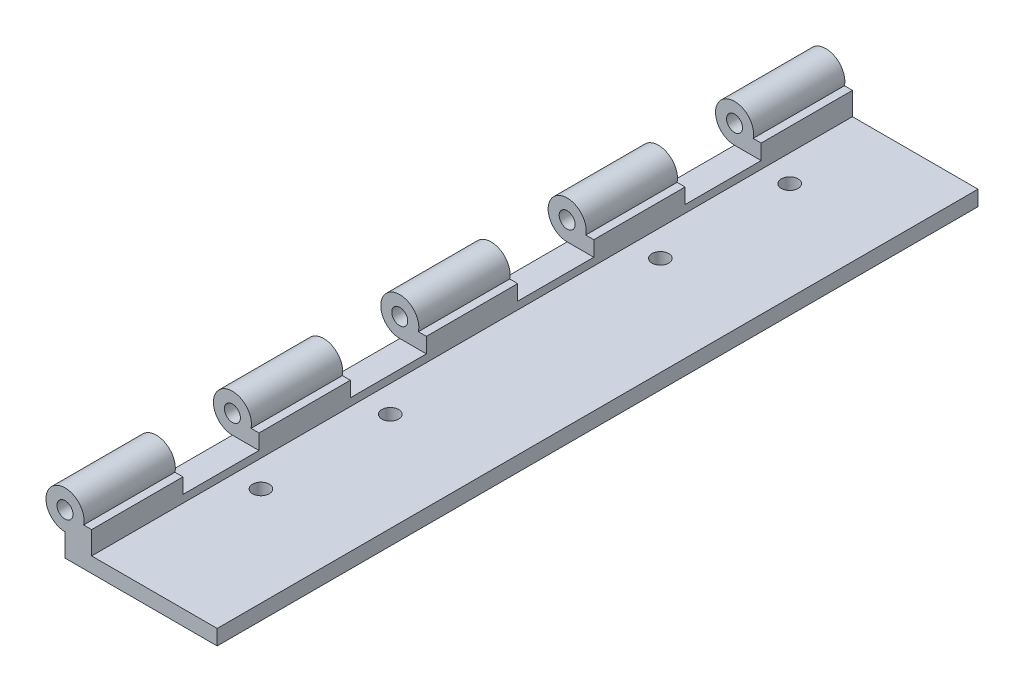
ISO-10303-21;
HEADER;
FILE_DESCRIPTION(('STEP AP214'),'2;1');
FILE_NAME('part.step','',(''),(''),'','','');
FILE_SCHEMA(('AUTOMOTIVE_DESIGN { 1 0 10303 214 1 1 1 1 }'));
ENDSEC;
DATA;
#1=APPLICATION_CONTEXT('core data for automotive mechanical design processes');
#2=APPLICATION_PROTOCOL_DEFINITION('international standard','automotive_design',2000,#1);
#3=PRODUCT_CONTEXT('',#1,'mechanical');
#4=PRODUCT('Part','Part','',(#3));
#5=PRODUCT_RELATED_PRODUCT_CATEGORY('part','',(#4));
#6=PRODUCT_DEFINITION_FORMATION('','',#4);
#7=PRODUCT_DEFINITION_CONTEXT('part definition',#1,'design');
#8=PRODUCT_DEFINITION('design','',#6,#7);
#9=PRODUCT_DEFINITION_SHAPE('','',#8);
#10=(LENGTH_UNIT() NAMED_UNIT(*) SI_UNIT(.MILLI.,.METRE.));
#11=(NAMED_UNIT(*) PLANE_ANGLE_UNIT() SI_UNIT($,.RADIAN.));
#12=(NAMED_UNIT(*) SI_UNIT($,.STERADIAN.) SOLID_ANGLE_UNIT());
#13=UNCERTAINTY_MEASURE_WITH_UNIT(LENGTH_MEASURE(1.E-05),#10,'distance_accuracy_value','');
#14=(GEOMETRIC_REPRESENTATION_CONTEXT(3) GLOBAL_UNCERTAINTY_ASSIGNED_CONTEXT((#13)) GLOBAL_UNIT_ASSIGNED_CONTEXT((#10,
#11,#12)) REPRESENTATION_CONTEXT('',''));
#15=CARTESIAN_POINT('',(0.,0.,0.));
#16=DIRECTION('',(0.,0.,1.));
#17=DIRECTION('',(1.,0.,0.));
#18=AXIS2_PLACEMENT_3D('',#15,#16,#17);
#19=CARTESIAN_POINT('',(0.,0.,0.));
#20=DIRECTION('',(0.,-1.,0.));
#21=DIRECTION('',(0.,0.,-1.));
#22=AXIS2_PLACEMENT_3D('',#19,#20,#21);
#23=PLANE('',#22);
#24=DIRECTION('',(-1.,0.,0.));
#25=VECTOR('',#24,1.);
#26=CARTESIAN_POINT('',(0.,0.,-13.));
#27=LINE('',#26,#25);
#28=CARTESIAN_POINT('',(0.,0.,-13.));
#29=VERTEX_POINT('',#28);
#30=CARTESIAN_POINT('',(-3.49999999999993,0.,-13.));
#31=VERTEX_POINT('',#30);
#32=EDGE_CURVE('E421',#29,#31,#27,.T.);
#33=ORIENTED_EDGE('',*,*,#32,.F.);
#34=DIRECTION('',(0.,0.,1.));
#35=VECTOR('',#34,1.);
#36=CARTESIAN_POINT('',(0.,0.,-101.));
#37=LINE('',#36,#35);
#38=CARTESIAN_POINT('',(0.,0.,-23.));
#39=VERTEX_POINT('',#38);
#40=EDGE_CURVE('E236',#39,#29,#37,.T.);
#41=ORIENTED_EDGE('',*,*,#40,.F.);
#42=DIRECTION('',(-1.,0.,0.));
#43=VECTOR('',#42,1.);
#44=CARTESIAN_POINT('',(0.,0.,-23.));
#45=LINE('',#44,#43);
#46=CARTESIAN_POINT('',(-3.49999999999995,0.,-23.));
#47=VERTEX_POINT('',#46);
#48=EDGE_CURVE('E371',#39,#47,#45,.T.);
#49=ORIENTED_EDGE('',*,*,#48,.T.);
#50=DIRECTION('',(0.,0.,-1.));
#51=VECTOR('',#50,1.);
#52=CARTESIAN_POINT('',(-3.49999999999993,0.,-1.00000000000001));
#53=LINE('',#52,#51);
#54=EDGE_CURVE('E215',#31,#47,#53,.T.);
#55=ORIENTED_EDGE('',*,*,#54,.F.);
#56=EDGE_LOOP('',(#33,#41,#49,#55));
#57=FACE_BOUND('',#56,.T.);
#58=ADVANCED_FACE('F41',(#57),#23,.F.);
#59=DIRECTION('',(-1.,0.,0.));
#60=VECTOR('',#59,1.);
#61=CARTESIAN_POINT('',(0.,0.,-35.));
#62=LINE('',#61,#60);
#63=CARTESIAN_POINT('',(0.,0.,-35.));
#64=VERTEX_POINT('',#63);
#65=CARTESIAN_POINT('',(-3.49999999999996,0.,-35.));
#66=VERTEX_POINT('',#65);
#67=EDGE_CURVE('E377',#64,#66,#62,.T.);
#68=ORIENTED_EDGE('',*,*,#67,.F.);
#69=CARTESIAN_POINT('',(0.,0.,-45.));
#70=VERTEX_POINT('',#69);
#71=EDGE_CURVE('E255',#70,#64,#37,.T.);
#72=ORIENTED_EDGE('',*,*,#71,.F.);
#73=DIRECTION('',(-1.,0.,0.));
#74=VECTOR('',#73,1.);
#75=CARTESIAN_POINT('',(0.,0.,-45.));
#76=LINE('',#75,#74);
#77=CARTESIAN_POINT('',(-3.49999999999996,0.,-45.));
#78=VERTEX_POINT('',#77);
#79=EDGE_CURVE('E340',#70,#78,#76,.T.);
#80=ORIENTED_EDGE('',*,*,#79,.T.);
#81=EDGE_CURVE('E407',#66,#78,#53,.T.);
#82=ORIENTED_EDGE('',*,*,#81,.F.);
#83=EDGE_LOOP('',(#68,#72,#80,#82));
#84=FACE_BOUND('',#83,.T.);
#85=ADVANCED_FACE('F475',(#84),#23,.F.);
#86=DIRECTION('',(-1.,0.,0.));
#87=VECTOR('',#86,1.);
#88=CARTESIAN_POINT('',(0.,0.,-57.));
#89=LINE('',#88,#87);
#90=CARTESIAN_POINT('',(0.,0.,-57.));
#91=VERTEX_POINT('',#90);
#92=CARTESIAN_POINT('',(-3.49999999999997,0.,-57.));
#93=VERTEX_POINT('',#92);
#94=EDGE_CURVE('E336',#91,#93,#89,.T.);
#95=ORIENTED_EDGE('',*,*,#94,.F.);
#96=CARTESIAN_POINT('',(0.,0.,-67.));
#97=VERTEX_POINT('',#96);
#98=EDGE_CURVE('E515',#97,#91,#37,.T.);
#99=ORIENTED_EDGE('',*,*,#98,.F.);
#100=DIRECTION('',(-1.,0.,0.));
#101=VECTOR('',#100,1.);
#102=CARTESIAN_POINT('',(0.,0.,-67.));
#103=LINE('',#102,#101);
#104=CARTESIAN_POINT('',(-3.49999999999998,0.,-67.));
#105=VERTEX_POINT('',#104);
#106=EDGE_CURVE('E282',#97,#105,#103,.T.);
#107=ORIENTED_EDGE('',*,*,#106,.T.);
#108=EDGE_CURVE('E499',#93,#105,#53,.T.);
#109=ORIENTED_EDGE('',*,*,#108,.F.);
#110=EDGE_LOOP('',(#95,#99,#107,#109));
#111=FACE_BOUND('',#110,.T.);
#112=ADVANCED_FACE('F465',(#111),#23,.F.);
#113=CARTESIAN_POINT('',(16.5000000000001,-2.,-1.00000000000001));
#114=DIRECTION('',(-1.,0.,0.));
#115=DIRECTION('',(0.,0.,1.));
#116=AXIS2_PLACEMENT_3D('',#113,#114,#115);
#117=PLANE('',#116);
#118=DIRECTION('',(0.,0.,-1.));
#119=VECTOR('',#118,1.);
#120=CARTESIAN_POINT('',(16.5000000000001,-1.,-101.));
#121=LINE('',#120,#119);
#122=CARTESIAN_POINT('',(16.5000000000001,-1.,-1.00000000000001));
#123=VERTEX_POINT('',#122);
#124=CARTESIAN_POINT('',(16.5000000000001,-1.,-101.));
#125=VERTEX_POINT('',#124);
#126=EDGE_CURVE('E247',#123,#125,#121,.T.);
#127=ORIENTED_EDGE('',*,*,#126,.F.);
#128=DIRECTION('',(0.,1.,0.));
#129=VECTOR('',#128,1.);
#130=CARTESIAN_POINT('',(16.5000000000001,-2.,-1.00000000000001));
#131=LINE('',#130,#129);
#132=CARTESIAN_POINT('',(16.5000000000001,-3.,-1.00000000000001));
#133=VERTEX_POINT('',#132);
#134=EDGE_CURVE('E212',#133,#123,#131,.T.);
#135=ORIENTED_EDGE('',*,*,#134,.F.);
#136=DIRECTION('',(0.,0.,1.));
#137=VECTOR('',#136,1.);
#138=CARTESIAN_POINT('',(16.5000000000001,-3.,-101.));
#139=LINE('',#138,#137);
#140=CARTESIAN_POINT('',(16.5000000000001,-3.,-101.));
#141=VERTEX_POINT('',#140);
#142=EDGE_CURVE('E226',#141,#133,#139,.T.);
#143=ORIENTED_EDGE('',*,*,#142,.F.);
#144=DIRECTION('',(0.,1.,0.));
#145=VECTOR('',#144,1.);
#146=CARTESIAN_POINT('',(16.5000000000001,-2.,-101.));
#147=LINE('',#146,#145);
#148=EDGE_CURVE('E409',#141,#125,#147,.T.);
#149=ORIENTED_EDGE('',*,*,#148,.T.);
#150=EDGE_LOOP('',(#127,#135,#143,#149));
#151=FACE_BOUND('',#150,.T.);
#152=ADVANCED_FACE('F459',(#151),#117,.F.);
#153=CARTESIAN_POINT('',(3.5,-2.,-19.75));
#154=DIRECTION('',(0.,1.,0.));
#155=DIRECTION('',(0.,0.,1.));
#156=AXIS2_PLACEMENT_3D('',#153,#154,#155);
#157=CYLINDRICAL_SURFACE('',#156,1.1);
#158=CARTESIAN_POINT('',(3.5,-1.,-19.75));
#159=DIRECTION('',(0.,1.,0.));
#160=DIRECTION('',(0.,0.,1.));
#161=AXIS2_PLACEMENT_3D('',#158,#159,#160);
#162=CIRCLE('',#161,1.1);
#163=CARTESIAN_POINT('',(3.5,-1.,-18.65));
#164=VERTEX_POINT('',#163);
#165=EDGE_CURVE('E260',#164,#164,#162,.F.);
#166=ORIENTED_EDGE('',*,*,#165,.F.);
#167=EDGE_LOOP('',(#166));
#168=FACE_BOUND('',#167,.T.);
#169=CARTESIAN_POINT('',(3.5,-3.,-19.75));
#170=DIRECTION('',(0.,-1.,0.));
#171=DIRECTION('',(0.,0.,-1.));
#172=AXIS2_PLACEMENT_3D('',#169,#170,#171);
#173=CIRCLE('',#172,1.1);
#174=CARTESIAN_POINT('',(3.5,-3.,-20.85));
#175=VERTEX_POINT('',#174);
#176=EDGE_CURVE('E758',#175,#175,#173,.T.);
#177=ORIENTED_EDGE('',*,*,#176,.T.);
#178=EDGE_LOOP('',(#177));
#179=FACE_BOUND('',#178,.T.);
#180=ADVANCED_FACE('F462',(#168,#179),#157,.F.);
#181=CARTESIAN_POINT('',(3.5,-2.,-36.75));
#182=DIRECTION('',(0.,1.,0.));
#183=DIRECTION('',(0.,0.,1.));
#184=AXIS2_PLACEMENT_3D('',#181,#182,#183);
#185=CYLINDRICAL_SURFACE('',#184,1.1);
#186=CARTESIAN_POINT('',(3.5,-1.,-36.75));
#187=DIRECTION('',(0.,1.,0.));
#188=DIRECTION('',(0.,0.,1.));
#189=AXIS2_PLACEMENT_3D('',#186,#187,#188);
#190=CIRCLE('',#189,1.1);
#191=CARTESIAN_POINT('',(3.5,-1.,-35.65));
#192=VERTEX_POINT('',#191);
#193=EDGE_CURVE('E258',#192,#192,#190,.F.);
#194=ORIENTED_EDGE('',*,*,#193,.F.);
#195=EDGE_LOOP('',(#194));
#196=FACE_BOUND('',#195,.T.);
#197=CARTESIAN_POINT('',(3.5,-3.,-36.75));
#198=DIRECTION('',(0.,-1.,0.));
#199=DIRECTION('',(0.,0.,-1.));
#200=AXIS2_PLACEMENT_3D('',#197,#198,#199);
#201=CIRCLE('',#200,1.1);
#202=CARTESIAN_POINT('',(3.5,-3.,-37.85));
#203=VERTEX_POINT('',#202);
#204=EDGE_CURVE('E757',#203,#203,#201,.T.);
#205=ORIENTED_EDGE('',*,*,#204,.T.);
#206=EDGE_LOOP('',(#205));
#207=FACE_BOUND('',#206,.T.);
#208=ADVANCED_FACE('F469',(#196,#207),#185,.F.);
#209=CARTESIAN_POINT('',(3.5,-2.,-72.25));
#210=DIRECTION('',(0.,1.,0.));
#211=DIRECTION('',(0.,0.,1.));
#212=AXIS2_PLACEMENT_3D('',#209,#210,#211);
#213=CYLINDRICAL_SURFACE('',#212,1.1);
#214=CARTESIAN_POINT('',(3.5,-1.,-72.25));
#215=DIRECTION('',(0.,1.,0.));
#216=DIRECTION('',(0.,0.,1.));
#217=AXIS2_PLACEMENT_3D('',#214,#215,#216);
#218=CIRCLE('',#217,1.1);
#219=CARTESIAN_POINT('',(3.5,-1.,-71.15));
#220=VERTEX_POINT('',#219);
#221=EDGE_CURVE('E254',#220,#220,#218,.F.);
#222=ORIENTED_EDGE('',*,*,#221,.F.);
#223=EDGE_LOOP('',(#222));
#224=FACE_BOUND('',#223,.T.);
#225=CARTESIAN_POINT('',(3.5,-3.,-72.25));
#226=DIRECTION('',(0.,-1.,0.));
#227=DIRECTION('',(0.,0.,-1.));
#228=AXIS2_PLACEMENT_3D('',#225,#226,#227);
#229=CIRCLE('',#228,1.1);
#230=CARTESIAN_POINT('',(3.5,-3.,-73.35));
#231=VERTEX_POINT('',#230);
#232=EDGE_CURVE('E231',#231,#231,#229,.T.);
#233=ORIENTED_EDGE('',*,*,#232,.T.);
#234=EDGE_LOOP('',(#233));
#235=FACE_BOUND('',#234,.T.);
#236=ADVANCED_FACE('F492',(#224,#235),#213,.F.);
#237=CARTESIAN_POINT('',(3.5,-2.,-89.25));
#238=DIRECTION('',(0.,1.,0.));
#239=DIRECTION('',(0.,0.,1.));
#240=AXIS2_PLACEMENT_3D('',#237,#238,#239);
#241=CYLINDRICAL_SURFACE('',#240,1.1);
#242=CARTESIAN_POINT('',(3.5,-1.,-89.25));
#243=DIRECTION('',(0.,1.,0.));
#244=DIRECTION('',(0.,0.,1.));
#245=AXIS2_PLACEMENT_3D('',#242,#243,#244);
#246=CIRCLE('',#245,1.1);
#247=CARTESIAN_POINT('',(3.5,-1.,-88.15));
#248=VERTEX_POINT('',#247);
#249=EDGE_CURVE('E44',#248,#248,#246,.F.);
#250=ORIENTED_EDGE('',*,*,#249,.F.);
#251=EDGE_LOOP('',(#250));
#252=FACE_BOUND('',#251,.T.);
#253=CARTESIAN_POINT('',(3.5,-3.,-89.25));
#254=DIRECTION('',(0.,-1.,0.));
#255=DIRECTION('',(0.,0.,-1.));
#256=AXIS2_PLACEMENT_3D('',#253,#254,#255);
#257=CIRCLE('',#256,1.1);
#258=CARTESIAN_POINT('',(3.5,-3.,-90.35));
#259=VERTEX_POINT('',#258);
#260=EDGE_CURVE('E228',#259,#259,#257,.T.);
#261=ORIENTED_EDGE('',*,*,#260,.T.);
#262=EDGE_LOOP('',(#261));
#263=FACE_BOUND('',#262,.T.);
#264=ADVANCED_FACE('F488',(#252,#263),#241,.F.);
#265=DIRECTION('',(-1.,0.,0.));
#266=VECTOR('',#265,1.);
#267=CARTESIAN_POINT('',(0.,0.,-79.));
#268=LINE('',#267,#266);
#269=CARTESIAN_POINT('',(0.,0.,-79.));
#270=VERTEX_POINT('',#269);
#271=CARTESIAN_POINT('',(-3.49999999999993,0.,-79.));
#272=VERTEX_POINT('',#271);
#273=EDGE_CURVE('E59',#270,#272,#268,.T.);
#274=ORIENTED_EDGE('',*,*,#273,.F.);
#275=CARTESIAN_POINT('',(0.,0.,-89.));
#276=VERTEX_POINT('',#275);
#277=EDGE_CURVE('E241',#276,#270,#37,.T.);
#278=ORIENTED_EDGE('',*,*,#277,.F.);
#279=DIRECTION('',(-1.,0.,0.));
#280=VECTOR('',#279,1.);
#281=CARTESIAN_POINT('',(0.,0.,-89.));
#282=LINE('',#281,#280);
#283=CARTESIAN_POINT('',(-3.49999999999999,0.,-89.));
#284=VERTEX_POINT('',#283);
#285=EDGE_CURVE('E308',#276,#284,#282,.T.);
#286=ORIENTED_EDGE('',*,*,#285,.T.);
#287=EDGE_CURVE('E391',#272,#284,#53,.T.);
#288=ORIENTED_EDGE('',*,*,#287,.F.);
#289=EDGE_LOOP('',(#274,#278,#286,#288));
#290=FACE_BOUND('',#289,.T.);
#291=ADVANCED_FACE('F471',(#290),#23,.F.);
#292=CARTESIAN_POINT('',(-3.49999999999994,2.5,-1.00000000000001));
#293=DIRECTION('',(0.,0.,-1.));
#294=DIRECTION('',(-1.,0.,0.));
#295=AXIS2_PLACEMENT_3D('',#292,#293,#294);
#296=CYLINDRICAL_SURFACE('',#295,2.5);
#297=CARTESIAN_POINT('',(-3.49999999999994,2.5,-13.));
#298=DIRECTION('',(0.,0.,-1.));
#299=DIRECTION('',(-1.,0.,0.));
#300=AXIS2_PLACEMENT_3D('',#297,#298,#299);
#301=CIRCLE('',#300,2.5);
#302=CARTESIAN_POINT('',(-1.05051025721676,2.,-13.));
#303=VERTEX_POINT('',#302);
#304=EDGE_CURVE('E429',#31,#303,#301,.T.);
#305=ORIENTED_EDGE('',*,*,#304,.F.);
#306=DIRECTION('',(0.,0.,-1.));
#307=VECTOR('',#306,1.);
#308=CARTESIAN_POINT('',(-3.49999999999993,0.,-1.00000000000001));
#309=LINE('',#308,#307);
#310=CARTESIAN_POINT('',(-3.49999999999993,0.,-1.00000000000001));
#311=VERTEX_POINT('',#310);
#312=EDGE_CURVE('E420',#311,#31,#309,.T.);
#313=ORIENTED_EDGE('',*,*,#312,.F.);
#314=CARTESIAN_POINT('',(-3.49999999999994,2.5,-1.00000000000001));
#315=DIRECTION('',(0.,0.,-1.));
#316=DIRECTION('',(-1.,0.,0.));
#317=AXIS2_PLACEMENT_3D('',#314,#315,#316);
#318=CIRCLE('',#317,2.5);
#319=CARTESIAN_POINT('',(-1.05051025721676,2.,-1.00000000000001));
#320=VERTEX_POINT('',#319);
#321=EDGE_CURVE('E210',#311,#320,#318,.T.);
#322=ORIENTED_EDGE('',*,*,#321,.T.);
#323=DIRECTION('',(0.,0.,-1.));
#324=VECTOR('',#323,1.);
#325=CARTESIAN_POINT('',(-1.05051025721676,2.,-1.00000000000001));
#326=LINE('',#325,#324);
#327=EDGE_CURVE('E414',#320,#303,#326,.T.);
#328=ORIENTED_EDGE('',*,*,#327,.T.);
#329=EDGE_LOOP('',(#305,#313,#322,#328));
#330=FACE_BOUND('',#329,.T.);
#331=ADVANCED_FACE('F450',(#330),#296,.T.);
#332=CARTESIAN_POINT('',(-3.5,2.5,-101.));
#333=DIRECTION('',(0.,0.,-1.));
#334=DIRECTION('',(-1.,0.,0.));
#335=AXIS2_PLACEMENT_3D('',#332,#333,#334);
#336=CYLINDRICAL_SURFACE('',#335,1.04999999999998);
#337=CARTESIAN_POINT('',(-3.5,2.5,-13.));
#338=DIRECTION('',(0.,0.,-1.));
#339=DIRECTION('',(-1.,0.,0.));
#340=AXIS2_PLACEMENT_3D('',#337,#338,#339);
#341=CIRCLE('',#340,1.04999999999998);
#342=CARTESIAN_POINT('',(-4.54999999999998,2.5,-13.));
#343=VERTEX_POINT('',#342);
#344=EDGE_CURVE('E416',#343,#343,#341,.T.);
#345=ORIENTED_EDGE('',*,*,#344,.T.);
#346=EDGE_LOOP('',(#345));
#347=FACE_BOUND('',#346,.T.);
#348=CARTESIAN_POINT('',(-3.5,2.5,-1.00000000000001));
#349=DIRECTION('',(0.,0.,-1.));
#350=DIRECTION('',(-1.,0.,0.));
#351=AXIS2_PLACEMENT_3D('',#348,#349,#350);
#352=CIRCLE('',#351,1.04999999999998);
#353=CARTESIAN_POINT('',(-4.54999999999998,2.5,-1.00000000000001));
#354=VERTEX_POINT('',#353);
#355=EDGE_CURVE('E419',#354,#354,#352,.T.);
#356=ORIENTED_EDGE('',*,*,#355,.F.);
#357=EDGE_LOOP('',(#356));
#358=FACE_BOUND('',#357,.T.);
#359=ADVANCED_FACE('F43',(#347,#358),#336,.F.);
#360=CARTESIAN_POINT('',(-3.49999999999994,2.5,-13.));
#361=DIRECTION('',(0.,0.,-1.));
#362=DIRECTION('',(-1.,0.,0.));
#363=AXIS2_PLACEMENT_3D('',#360,#361,#362);
#364=PLANE('',#363);
#365=ORIENTED_EDGE('',*,*,#344,.F.);
#366=EDGE_LOOP('',(#365));
#367=FACE_BOUND('',#366,.T.);
#368=ORIENTED_EDGE('',*,*,#304,.T.);
#369=DIRECTION('',(1.,0.,0.));
#370=VECTOR('',#369,1.);
#371=CARTESIAN_POINT('',(-1.05051025721676,2.,-13.));
#372=LINE('',#371,#370);
#373=CARTESIAN_POINT('',(0.,2.,-13.));
#374=VERTEX_POINT('',#373);
#375=EDGE_CURVE('E430',#303,#374,#372,.T.);
#376=ORIENTED_EDGE('',*,*,#375,.T.);
#377=DIRECTION('',(0.,-1.,0.));
#378=VECTOR('',#377,1.);
#379=CARTESIAN_POINT('',(0.,2.,-13.));
#380=LINE('',#379,#378);
#381=EDGE_CURVE('E422',#374,#29,#380,.T.);
#382=ORIENTED_EDGE('',*,*,#381,.T.);
#383=ORIENTED_EDGE('',*,*,#32,.T.);
#384=EDGE_LOOP('',(#368,#376,#382,#383));
#385=FACE_BOUND('',#384,.T.);
#386=ADVANCED_FACE('F444',(#367,#385),#364,.T.);
#387=CARTESIAN_POINT('',(-3.49999999999994,2.5,-1.00000000000001));
#388=DIRECTION('',(0.,0.,-1.));
#389=DIRECTION('',(-1.,0.,0.));
#390=AXIS2_PLACEMENT_3D('',#387,#388,#389);
#391=PLANE('',#390);
#392=ORIENTED_EDGE('',*,*,#355,.T.);
#393=EDGE_LOOP('',(#392));
#394=FACE_BOUND('',#393,.T.);
#395=DIRECTION('',(1.,0.,0.));
#396=VECTOR('',#395,1.);
#397=CARTESIAN_POINT('',(0.,-1.,-1.00000000000001));
#398=LINE('',#397,#396);
#399=CARTESIAN_POINT('',(0.,-1.,-1.00000000000001));
#400=VERTEX_POINT('',#399);
#401=EDGE_CURVE('E244',#400,#123,#398,.T.);
#402=ORIENTED_EDGE('',*,*,#401,.F.);
#403=DIRECTION('',(0.,-1.,0.));
#404=VECTOR('',#403,1.);
#405=CARTESIAN_POINT('',(0.,2.,-1.00000000000001));
#406=LINE('',#405,#404);
#407=CARTESIAN_POINT('',(0.,2.,-1.00000000000001));
#408=VERTEX_POINT('',#407);
#409=EDGE_CURVE('E11',#408,#400,#406,.T.);
#410=ORIENTED_EDGE('',*,*,#409,.F.);
#411=DIRECTION('',(1.,0.,0.));
#412=VECTOR('',#411,1.);
#413=CARTESIAN_POINT('',(-1.05051025721676,2.,-1.00000000000001));
#414=LINE('',#413,#412);
#415=EDGE_CURVE('E417',#320,#408,#414,.T.);
#416=ORIENTED_EDGE('',*,*,#415,.F.);
#417=ORIENTED_EDGE('',*,*,#321,.F.);
#418=DIRECTION('',(0.,1.,0.));
#419=VECTOR('',#418,1.);
#420=CARTESIAN_POINT('',(-3.49999999999993,-2.,-1.00000000000001));
#421=LINE('',#420,#419);
#422=CARTESIAN_POINT('',(-3.49999999999993,-3.,-1.00000000000001));
#423=VERTEX_POINT('',#422);
#424=EDGE_CURVE('E198',#423,#311,#421,.T.);
#425=ORIENTED_EDGE('',*,*,#424,.F.);
#426=DIRECTION('',(-1.,0.,0.));
#427=VECTOR('',#426,1.);
#428=CARTESIAN_POINT('',(16.5000000000001,-3.,-1.00000000000001));
#429=LINE('',#428,#427);
#430=EDGE_CURVE('E203',#133,#423,#429,.T.);
#431=ORIENTED_EDGE('',*,*,#430,.F.);
#432=ORIENTED_EDGE('',*,*,#134,.T.);
#433=EDGE_LOOP('',(#402,#410,#416,#417,#425,#431,#432));
#434=FACE_BOUND('',#433,.T.);
#435=ADVANCED_FACE('F201',(#394,#434),#391,.F.);
#436=CARTESIAN_POINT('',(0.,2.,0.));
#437=DIRECTION('',(0.,1.,0.));
#438=DIRECTION('',(0.,0.,1.));
#439=AXIS2_PLACEMENT_3D('',#436,#437,#438);
#440=PLANE('',#439);
#441=ORIENTED_EDGE('',*,*,#415,.T.);
#442=DIRECTION('',(0.,0.,-1.));
#443=VECTOR('',#442,1.);
#444=CARTESIAN_POINT('',(0.,2.,0.));
#445=LINE('',#444,#443);
#446=EDGE_CURVE('E49',#408,#374,#445,.T.);
#447=ORIENTED_EDGE('',*,*,#446,.T.);
#448=ORIENTED_EDGE('',*,*,#375,.F.);
#449=ORIENTED_EDGE('',*,*,#327,.F.);
#450=EDGE_LOOP('',(#441,#447,#448,#449));
#451=FACE_BOUND('',#450,.T.);
#452=ADVANCED_FACE('F442',(#451),#440,.T.);
#453=CARTESIAN_POINT('',(0.,111.,-124.492582712501));
#454=DIRECTION('',(1.,0.,0.));
#455=DIRECTION('',(0.,0.,-1.));
#456=AXIS2_PLACEMENT_3D('',#453,#454,#455);
#457=PLANE('',#456);
#458=ORIENTED_EDGE('',*,*,#409,.T.);
#459=DIRECTION('',(0.,0.,1.));
#460=VECTOR('',#459,1.);
#461=CARTESIAN_POINT('',(0.,-1.,-101.));
#462=LINE('',#461,#460);
#463=CARTESIAN_POINT('',(0.,-1.,-101.));
#464=VERTEX_POINT('',#463);
#465=EDGE_CURVE('E238',#464,#400,#462,.T.);
#466=ORIENTED_EDGE('',*,*,#465,.F.);
#467=DIRECTION('',(0.,-1.,0.));
#468=VECTOR('',#467,1.);
#469=CARTESIAN_POINT('',(0.,2.,-101.));
#470=LINE('',#469,#468);
#471=CARTESIAN_POINT('',(0.,2.,-101.));
#472=VERTEX_POINT('',#471);
#473=EDGE_CURVE('E305',#472,#464,#470,.T.);
#474=ORIENTED_EDGE('',*,*,#473,.F.);
#475=DIRECTION('',(0.,0.,-1.));
#476=VECTOR('',#475,1.);
#477=CARTESIAN_POINT('',(0.,2.,0.));
#478=LINE('',#477,#476);
#479=CARTESIAN_POINT('',(0.,2.,-89.));
#480=VERTEX_POINT('',#479);
#481=EDGE_CURVE('E320',#480,#472,#478,.T.);
#482=ORIENTED_EDGE('',*,*,#481,.F.);
#483=DIRECTION('',(0.,-1.,0.));
#484=VECTOR('',#483,1.);
#485=CARTESIAN_POINT('',(0.,2.,-89.));
#486=LINE('',#485,#484);
#487=EDGE_CURVE('E319',#480,#276,#486,.T.);
#488=ORIENTED_EDGE('',*,*,#487,.T.);
#489=ORIENTED_EDGE('',*,*,#277,.T.);
#490=DIRECTION('',(0.,-1.,0.));
#491=VECTOR('',#490,1.);
#492=CARTESIAN_POINT('',(0.,2.,-79.));
#493=LINE('',#492,#491);
#494=CARTESIAN_POINT('',(0.,2.,-79.));
#495=VERTEX_POINT('',#494);
#496=EDGE_CURVE('E286',#495,#270,#493,.T.);
#497=ORIENTED_EDGE('',*,*,#496,.F.);
#498=DIRECTION('',(0.,0.,-1.));
#499=VECTOR('',#498,1.);
#500=CARTESIAN_POINT('',(0.,2.,0.));
#501=LINE('',#500,#499);
#502=CARTESIAN_POINT('',(0.,2.,-67.));
#503=VERTEX_POINT('',#502);
#504=EDGE_CURVE('E265',#503,#495,#501,.T.);
#505=ORIENTED_EDGE('',*,*,#504,.F.);
#506=DIRECTION('',(0.,-1.,0.));
#507=VECTOR('',#506,1.);
#508=CARTESIAN_POINT('',(0.,2.,-67.));
#509=LINE('',#508,#507);
#510=EDGE_CURVE('E277',#503,#97,#509,.T.);
#511=ORIENTED_EDGE('',*,*,#510,.T.);
#512=ORIENTED_EDGE('',*,*,#98,.T.);
#513=DIRECTION('',(0.,-1.,0.));
#514=VECTOR('',#513,1.);
#515=CARTESIAN_POINT('',(0.,2.,-57.));
#516=LINE('',#515,#514);
#517=CARTESIAN_POINT('',(0.,2.,-57.));
#518=VERTEX_POINT('',#517);
#519=EDGE_CURVE('E345',#518,#91,#516,.T.);
#520=ORIENTED_EDGE('',*,*,#519,.F.);
#521=DIRECTION('',(0.,0.,-1.));
#522=VECTOR('',#521,1.);
#523=CARTESIAN_POINT('',(0.,2.,0.));
#524=LINE('',#523,#522);
#525=CARTESIAN_POINT('',(0.,2.,-45.));
#526=VERTEX_POINT('',#525);
#527=EDGE_CURVE('E360',#526,#518,#524,.T.);
#528=ORIENTED_EDGE('',*,*,#527,.F.);
#529=DIRECTION('',(0.,-1.,0.));
#530=VECTOR('',#529,1.);
#531=CARTESIAN_POINT('',(0.,2.,-45.));
#532=LINE('',#531,#530);
#533=EDGE_CURVE('E352',#526,#70,#532,.T.);
#534=ORIENTED_EDGE('',*,*,#533,.T.);
#535=ORIENTED_EDGE('',*,*,#71,.T.);
#536=DIRECTION('',(0.,-1.,0.));
#537=VECTOR('',#536,1.);
#538=CARTESIAN_POINT('',(0.,2.,-35.));
#539=LINE('',#538,#537);
#540=CARTESIAN_POINT('',(0.,2.,-35.));
#541=VERTEX_POINT('',#540);
#542=EDGE_CURVE('E378',#541,#64,#539,.T.);
#543=ORIENTED_EDGE('',*,*,#542,.F.);
#544=DIRECTION('',(0.,0.,-1.));
#545=VECTOR('',#544,1.);
#546=CARTESIAN_POINT('',(0.,2.,0.));
#547=LINE('',#546,#545);
#548=CARTESIAN_POINT('',(0.,2.,-23.));
#549=VERTEX_POINT('',#548);
#550=EDGE_CURVE('E393',#549,#541,#547,.T.);
#551=ORIENTED_EDGE('',*,*,#550,.F.);
#552=DIRECTION('',(0.,-1.,0.));
#553=VECTOR('',#552,1.);
#554=CARTESIAN_POINT('',(0.,2.,-23.));
#555=LINE('',#554,#553);
#556=EDGE_CURVE('E392',#549,#39,#555,.T.);
#557=ORIENTED_EDGE('',*,*,#556,.T.);
#558=ORIENTED_EDGE('',*,*,#40,.T.);
#559=ORIENTED_EDGE('',*,*,#381,.F.);
#560=ORIENTED_EDGE('',*,*,#446,.F.);
#561=EDGE_LOOP('',(#458,#466,#474,#482,#488,#489,#497,#505,#511,#512,#520,#528,#534,#535,#543,
#551,#557,#558,#559,#560));
#562=FACE_BOUND('',#561,.T.);
#563=ADVANCED_FACE('F449',(#562),#457,.T.);
#564=CARTESIAN_POINT('',(-3.49999999999993,-2.,-1.00000000000001));
#565=DIRECTION('',(1.,0.,0.));
#566=DIRECTION('',(0.,0.,-1.));
#567=AXIS2_PLACEMENT_3D('',#564,#565,#566);
#568=PLANE('',#567);
#569=ORIENTED_EDGE('',*,*,#312,.T.);
#570=ORIENTED_EDGE('',*,*,#54,.T.);
#571=DIRECTION('',(0.,0.,-1.));
#572=VECTOR('',#571,1.);
#573=CARTESIAN_POINT('',(-3.49999999999995,0.,-23.));
#574=LINE('',#573,#572);
#575=EDGE_CURVE('E372',#47,#66,#574,.T.);
#576=ORIENTED_EDGE('',*,*,#575,.T.);
#577=ORIENTED_EDGE('',*,*,#81,.T.);
#578=DIRECTION('',(0.,0.,-1.));
#579=VECTOR('',#578,1.);
#580=CARTESIAN_POINT('',(-3.49999999999996,0.,-45.));
#581=LINE('',#580,#579);
#582=EDGE_CURVE('E331',#78,#93,#581,.T.);
#583=ORIENTED_EDGE('',*,*,#582,.T.);
#584=ORIENTED_EDGE('',*,*,#108,.T.);
#585=DIRECTION('',(0.,0.,-1.));
#586=VECTOR('',#585,1.);
#587=CARTESIAN_POINT('',(-3.49999999999998,0.,-67.));
#588=LINE('',#587,#586);
#589=EDGE_CURVE('E295',#105,#272,#588,.T.);
#590=ORIENTED_EDGE('',*,*,#589,.T.);
#591=ORIENTED_EDGE('',*,*,#287,.T.);
#592=DIRECTION('',(0.,0.,-1.));
#593=VECTOR('',#592,1.);
#594=CARTESIAN_POINT('',(-3.49999999999999,0.,-89.));
#595=LINE('',#594,#593);
#596=CARTESIAN_POINT('',(-3.5,0.,-101.));
#597=VERTEX_POINT('',#596);
#598=EDGE_CURVE('E306',#284,#597,#595,.T.);
#599=ORIENTED_EDGE('',*,*,#598,.T.);
#600=DIRECTION('',(0.,1.,0.));
#601=VECTOR('',#600,1.);
#602=CARTESIAN_POINT('',(-3.49999999999993,-2.,-101.));
#603=LINE('',#602,#601);
#604=CARTESIAN_POINT('',(-3.49999999999993,-3.,-101.));
#605=VERTEX_POINT('',#604);
#606=EDGE_CURVE('E216',#605,#597,#603,.T.);
#607=ORIENTED_EDGE('',*,*,#606,.F.);
#608=DIRECTION('',(0.,0.,-1.));
#609=VECTOR('',#608,1.);
#610=CARTESIAN_POINT('',(-3.49999999999993,-3.,-1.00000000000001));
#611=LINE('',#610,#609);
#612=EDGE_CURVE('E213',#423,#605,#611,.T.);
#613=ORIENTED_EDGE('',*,*,#612,.F.);
#614=ORIENTED_EDGE('',*,*,#424,.T.);
#615=EDGE_LOOP('',(#569,#570,#576,#577,#583,#584,#590,#591,#599,#607,#613,#614));
#616=FACE_BOUND('',#615,.T.);
#617=ADVANCED_FACE('F217',(#616),#568,.F.);
#618=CARTESIAN_POINT('',(-3.49999999999993,-2.,-101.));
#619=DIRECTION('',(0.,0.,1.));
#620=DIRECTION('',(1.,0.,0.));
#621=AXIS2_PLACEMENT_3D('',#618,#619,#620);
#622=PLANE('',#621);
#623=ORIENTED_EDGE('',*,*,#473,.T.);
#624=DIRECTION('',(-1.,0.,0.));
#625=VECTOR('',#624,1.);
#626=CARTESIAN_POINT('',(0.,-1.,-101.));
#627=LINE('',#626,#625);
#628=EDGE_CURVE('E248',#125,#464,#627,.T.);
#629=ORIENTED_EDGE('',*,*,#628,.F.);
#630=ORIENTED_EDGE('',*,*,#148,.F.);
#631=DIRECTION('',(1.,0.,0.));
#632=VECTOR('',#631,1.);
#633=CARTESIAN_POINT('',(-3.49999999999993,-3.,-101.));
#634=LINE('',#633,#632);
#635=EDGE_CURVE('E223',#605,#141,#634,.T.);
#636=ORIENTED_EDGE('',*,*,#635,.F.);
#637=ORIENTED_EDGE('',*,*,#606,.T.);
#638=CARTESIAN_POINT('',(-3.5,2.5,-101.));
#639=DIRECTION('',(0.,0.,-1.));
#640=DIRECTION('',(-1.,0.,0.));
#641=AXIS2_PLACEMENT_3D('',#638,#639,#640);
#642=CIRCLE('',#641,2.5);
#643=CARTESIAN_POINT('',(-1.05051025721682,2.,-101.));
#644=VERTEX_POINT('',#643);
#645=EDGE_CURVE('E296',#597,#644,#642,.T.);
#646=ORIENTED_EDGE('',*,*,#645,.T.);
#647=DIRECTION('',(1.,0.,0.));
#648=VECTOR('',#647,1.);
#649=CARTESIAN_POINT('',(-1.05051025721682,2.,-101.));
#650=LINE('',#649,#648);
#651=EDGE_CURVE('E303',#644,#472,#650,.T.);
#652=ORIENTED_EDGE('',*,*,#651,.T.);
#653=EDGE_LOOP('',(#623,#629,#630,#636,#637,#646,#652));
#654=FACE_BOUND('',#653,.T.);
#655=CARTESIAN_POINT('',(-3.5,2.5,-101.));
#656=DIRECTION('',(0.,0.,-1.));
#657=DIRECTION('',(-1.,0.,0.));
#658=AXIS2_PLACEMENT_3D('',#655,#656,#657);
#659=CIRCLE('',#658,1.04999999999999);
#660=CARTESIAN_POINT('',(-4.54999999999999,2.5,-101.));
#661=VERTEX_POINT('',#660);
#662=EDGE_CURVE('E301',#661,#661,#659,.T.);
#663=ORIENTED_EDGE('',*,*,#662,.F.);
#664=EDGE_LOOP('',(#663));
#665=FACE_BOUND('',#664,.T.);
#666=ADVANCED_FACE('F457',(#654,#665),#622,.F.);
#667=CARTESIAN_POINT('',(-3.49999999999995,2.5,-23.));
#668=DIRECTION('',(0.,0.,-1.));
#669=DIRECTION('',(-1.,0.,0.));
#670=AXIS2_PLACEMENT_3D('',#667,#668,#669);
#671=CYLINDRICAL_SURFACE('',#670,2.5);
#672=CARTESIAN_POINT('',(-3.49999999999996,2.5,-35.));
#673=DIRECTION('',(0.,0.,-1.));
#674=DIRECTION('',(-1.,0.,0.));
#675=AXIS2_PLACEMENT_3D('',#672,#673,#674);
#676=CIRCLE('',#675,2.5);
#677=CARTESIAN_POINT('',(-1.05051025721678,2.,-35.));
#678=VERTEX_POINT('',#677);
#679=EDGE_CURVE('E387',#66,#678,#676,.T.);
#680=ORIENTED_EDGE('',*,*,#679,.F.);
#681=ORIENTED_EDGE('',*,*,#575,.F.);
#682=CARTESIAN_POINT('',(-3.49999999999995,2.5,-23.));
#683=DIRECTION('',(0.,0.,-1.));
#684=DIRECTION('',(-1.,0.,0.));
#685=AXIS2_PLACEMENT_3D('',#682,#683,#684);
#686=CIRCLE('',#685,2.5);
#687=CARTESIAN_POINT('',(-1.05051025721677,2.,-23.));
#688=VERTEX_POINT('',#687);
#689=EDGE_CURVE('E357',#47,#688,#686,.T.);
#690=ORIENTED_EDGE('',*,*,#689,.T.);
#691=DIRECTION('',(0.,0.,-1.));
#692=VECTOR('',#691,1.);
#693=CARTESIAN_POINT('',(-1.05051025721677,2.,-23.));
#694=LINE('',#693,#692);
#695=EDGE_CURVE('E369',#688,#678,#694,.T.);
#696=ORIENTED_EDGE('',*,*,#695,.T.);
#697=EDGE_LOOP('',(#680,#681,#690,#696));
#698=FACE_BOUND('',#697,.T.);
#699=ADVANCED_FACE('F571',(#698),#671,.T.);
#700=CARTESIAN_POINT('',(-3.5,2.5,-101.));
#701=DIRECTION('',(0.,0.,-1.));
#702=DIRECTION('',(-1.,0.,0.));
#703=AXIS2_PLACEMENT_3D('',#700,#701,#702);
#704=CYLINDRICAL_SURFACE('',#703,1.04999999999998);
#705=CARTESIAN_POINT('',(-3.5,2.5,-35.));
#706=DIRECTION('',(0.,0.,-1.));
#707=DIRECTION('',(-1.,0.,0.));
#708=AXIS2_PLACEMENT_3D('',#705,#706,#707);
#709=CIRCLE('',#708,1.04999999999998);
#710=CARTESIAN_POINT('',(-4.54999999999998,2.5,-35.));
#711=VERTEX_POINT('',#710);
#712=EDGE_CURVE('E368',#711,#711,#709,.T.);
#713=ORIENTED_EDGE('',*,*,#712,.T.);
#714=EDGE_LOOP('',(#713));
#715=FACE_BOUND('',#714,.T.);
#716=CARTESIAN_POINT('',(-3.5,2.5,-23.));
#717=DIRECTION('',(0.,0.,-1.));
#718=DIRECTION('',(-1.,0.,0.));
#719=AXIS2_PLACEMENT_3D('',#716,#717,#718);
#720=CIRCLE('',#719,1.04999999999998);
#721=CARTESIAN_POINT('',(-4.54999999999998,2.5,-23.));
#722=VERTEX_POINT('',#721);
#723=EDGE_CURVE('E376',#722,#722,#720,.T.);
#724=ORIENTED_EDGE('',*,*,#723,.F.);
#725=EDGE_LOOP('',(#724));
#726=FACE_BOUND('',#725,.T.);
#727=ADVANCED_FACE('F572',(#715,#726),#704,.F.);
#728=CARTESIAN_POINT('',(-3.49999999999996,2.5,-35.));
#729=DIRECTION('',(0.,0.,-1.));
#730=DIRECTION('',(-1.,0.,0.));
#731=AXIS2_PLACEMENT_3D('',#728,#729,#730);
#732=PLANE('',#731);
#733=ORIENTED_EDGE('',*,*,#712,.F.);
#734=EDGE_LOOP('',(#733));
#735=FACE_BOUND('',#734,.T.);
#736=ORIENTED_EDGE('',*,*,#679,.T.);
#737=DIRECTION('',(1.,0.,0.));
#738=VECTOR('',#737,1.);
#739=CARTESIAN_POINT('',(-1.05051025721678,2.,-35.));
#740=LINE('',#739,#738);
#741=EDGE_CURVE('E381',#678,#541,#740,.T.);
#742=ORIENTED_EDGE('',*,*,#741,.T.);
#743=ORIENTED_EDGE('',*,*,#542,.T.);
#744=ORIENTED_EDGE('',*,*,#67,.T.);
#745=EDGE_LOOP('',(#736,#742,#743,#744));
#746=FACE_BOUND('',#745,.T.);
#747=ADVANCED_FACE('F576',(#735,#746),#732,.T.);
#748=CARTESIAN_POINT('',(-3.49999999999995,2.5,-23.));
#749=DIRECTION('',(0.,0.,-1.));
#750=DIRECTION('',(-1.,0.,0.));
#751=AXIS2_PLACEMENT_3D('',#748,#749,#750);
#752=PLANE('',#751);
#753=ORIENTED_EDGE('',*,*,#723,.T.);
#754=EDGE_LOOP('',(#753));
#755=FACE_BOUND('',#754,.T.);
#756=ORIENTED_EDGE('',*,*,#689,.F.);
#757=ORIENTED_EDGE('',*,*,#48,.F.);
#758=ORIENTED_EDGE('',*,*,#556,.F.);
#759=DIRECTION('',(1.,0.,0.));
#760=VECTOR('',#759,1.);
#761=CARTESIAN_POINT('',(-1.05051025721677,2.,-23.));
#762=LINE('',#761,#760);
#763=EDGE_CURVE('E374',#688,#549,#762,.T.);
#764=ORIENTED_EDGE('',*,*,#763,.F.);
#765=EDGE_LOOP('',(#756,#757,#758,#764));
#766=FACE_BOUND('',#765,.T.);
#767=ADVANCED_FACE('F578',(#755,#766),#752,.F.);
#768=CARTESIAN_POINT('',(0.,2.,0.));
#769=DIRECTION('',(0.,1.,0.));
#770=DIRECTION('',(0.,0.,1.));
#771=AXIS2_PLACEMENT_3D('',#768,#769,#770);
#772=PLANE('',#771);
#773=ORIENTED_EDGE('',*,*,#763,.T.);
#774=ORIENTED_EDGE('',*,*,#550,.T.);
#775=ORIENTED_EDGE('',*,*,#741,.F.);
#776=ORIENTED_EDGE('',*,*,#695,.F.);
#777=EDGE_LOOP('',(#773,#774,#775,#776));
#778=FACE_BOUND('',#777,.T.);
#779=ADVANCED_FACE('F553',(#778),#772,.T.);
#780=CARTESIAN_POINT('',(-3.49999999999996,2.5,-45.));
#781=DIRECTION('',(0.,0.,-1.));
#782=DIRECTION('',(-1.,0.,0.));
#783=AXIS2_PLACEMENT_3D('',#780,#781,#782);
#784=CYLINDRICAL_SURFACE('',#783,2.5);
#785=CARTESIAN_POINT('',(-3.49999999999997,2.5,-57.));
#786=DIRECTION('',(0.,0.,-1.));
#787=DIRECTION('',(-1.,0.,0.));
#788=AXIS2_PLACEMENT_3D('',#785,#786,#787);
#789=CIRCLE('',#788,2.5);
#790=CARTESIAN_POINT('',(-1.05051025721679,2.,-57.));
#791=VERTEX_POINT('',#790);
#792=EDGE_CURVE('E348',#93,#791,#789,.T.);
#793=ORIENTED_EDGE('',*,*,#792,.F.);
#794=ORIENTED_EDGE('',*,*,#582,.F.);
#795=CARTESIAN_POINT('',(-3.49999999999996,2.5,-45.));
#796=DIRECTION('',(0.,0.,-1.));
#797=DIRECTION('',(-1.,0.,0.));
#798=AXIS2_PLACEMENT_3D('',#795,#796,#797);
#799=CIRCLE('',#798,2.5);
#800=CARTESIAN_POINT('',(-1.05051025721679,2.,-45.));
#801=VERTEX_POINT('',#800);
#802=EDGE_CURVE('E322',#78,#801,#799,.T.);
#803=ORIENTED_EDGE('',*,*,#802,.T.);
#804=DIRECTION('',(0.,0.,-1.));
#805=VECTOR('',#804,1.);
#806=CARTESIAN_POINT('',(-1.05051025721679,2.,-45.));
#807=LINE('',#806,#805);
#808=EDGE_CURVE('E328',#801,#791,#807,.T.);
#809=ORIENTED_EDGE('',*,*,#808,.T.);
#810=EDGE_LOOP('',(#793,#794,#803,#809));
#811=FACE_BOUND('',#810,.T.);
#812=ADVANCED_FACE('F552',(#811),#784,.T.);
#813=CARTESIAN_POINT('',(-3.5,2.5,-101.));
#814=DIRECTION('',(0.,0.,-1.));
#815=DIRECTION('',(-1.,0.,0.));
#816=AXIS2_PLACEMENT_3D('',#813,#814,#815);
#817=CYLINDRICAL_SURFACE('',#816,1.04999999999998);
#818=CARTESIAN_POINT('',(-3.5,2.5,-57.));
#819=DIRECTION('',(0.,0.,-1.));
#820=DIRECTION('',(-1.,0.,0.));
#821=AXIS2_PLACEMENT_3D('',#818,#819,#820);
#822=CIRCLE('',#821,1.04999999999998);
#823=CARTESIAN_POINT('',(-4.54999999999998,2.5,-57.));
#824=VERTEX_POINT('',#823);
#825=EDGE_CURVE('E332',#824,#824,#822,.T.);
#826=ORIENTED_EDGE('',*,*,#825,.T.);
#827=EDGE_LOOP('',(#826));
#828=FACE_BOUND('',#827,.T.);
#829=CARTESIAN_POINT('',(-3.5,2.5,-45.));
#830=DIRECTION('',(0.,0.,-1.));
#831=DIRECTION('',(-1.,0.,0.));
#832=AXIS2_PLACEMENT_3D('',#829,#830,#831);
#833=CIRCLE('',#832,1.04999999999998);
#834=CARTESIAN_POINT('',(-4.54999999999998,2.5,-45.));
#835=VERTEX_POINT('',#834);
#836=EDGE_CURVE('E341',#835,#835,#833,.T.);
#837=ORIENTED_EDGE('',*,*,#836,.F.);
#838=EDGE_LOOP('',(#837));
#839=FACE_BOUND('',#838,.T.);
#840=ADVANCED_FACE('F551',(#828,#839),#817,.F.);
#841=CARTESIAN_POINT('',(-3.49999999999997,2.5,-57.));
#842=DIRECTION('',(0.,0.,-1.));
#843=DIRECTION('',(-1.,0.,0.));
#844=AXIS2_PLACEMENT_3D('',#841,#842,#843);
#845=PLANE('',#844);
#846=ORIENTED_EDGE('',*,*,#825,.F.);
#847=EDGE_LOOP('',(#846));
#848=FACE_BOUND('',#847,.T.);
#849=ORIENTED_EDGE('',*,*,#792,.T.);
#850=DIRECTION('',(1.,0.,0.));
#851=VECTOR('',#850,1.);
#852=CARTESIAN_POINT('',(-1.05051025721679,2.,-57.));
#853=LINE('',#852,#851);
#854=EDGE_CURVE('E344',#791,#518,#853,.T.);
#855=ORIENTED_EDGE('',*,*,#854,.T.);
#856=ORIENTED_EDGE('',*,*,#519,.T.);
#857=ORIENTED_EDGE('',*,*,#94,.T.);
#858=EDGE_LOOP('',(#849,#855,#856,#857));
#859=FACE_BOUND('',#858,.T.);
#860=ADVANCED_FACE('F557',(#848,#859),#845,.T.);
#861=CARTESIAN_POINT('',(-3.49999999999996,2.5,-45.));
#862=DIRECTION('',(0.,0.,-1.));
#863=DIRECTION('',(-1.,0.,0.));
#864=AXIS2_PLACEMENT_3D('',#861,#862,#863);
#865=PLANE('',#864);
#866=ORIENTED_EDGE('',*,*,#836,.T.);
#867=EDGE_LOOP('',(#866));
#868=FACE_BOUND('',#867,.T.);
#869=ORIENTED_EDGE('',*,*,#802,.F.);
#870=ORIENTED_EDGE('',*,*,#79,.F.);
#871=ORIENTED_EDGE('',*,*,#533,.F.);
#872=DIRECTION('',(1.,0.,0.));
#873=VECTOR('',#872,1.);
#874=CARTESIAN_POINT('',(-1.05051025721679,2.,-45.));
#875=LINE('',#874,#873);
#876=EDGE_CURVE('E338',#801,#526,#875,.T.);
#877=ORIENTED_EDGE('',*,*,#876,.F.);
#878=EDGE_LOOP('',(#869,#870,#871,#877));
#879=FACE_BOUND('',#878,.T.);
#880=ADVANCED_FACE('F559',(#868,#879),#865,.F.);
#881=CARTESIAN_POINT('',(0.,2.,0.));
#882=DIRECTION('',(0.,1.,0.));
#883=DIRECTION('',(0.,0.,1.));
#884=AXIS2_PLACEMENT_3D('',#881,#882,#883);
#885=PLANE('',#884);
#886=ORIENTED_EDGE('',*,*,#876,.T.);
#887=ORIENTED_EDGE('',*,*,#527,.T.);
#888=ORIENTED_EDGE('',*,*,#854,.F.);
#889=ORIENTED_EDGE('',*,*,#808,.F.);
#890=EDGE_LOOP('',(#886,#887,#888,#889));
#891=FACE_BOUND('',#890,.T.);
#892=ADVANCED_FACE('F549',(#891),#885,.T.);
#893=CARTESIAN_POINT('',(0.,2.,0.));
#894=DIRECTION('',(0.,1.,0.));
#895=DIRECTION('',(0.,0.,1.));
#896=AXIS2_PLACEMENT_3D('',#893,#894,#895);
#897=PLANE('',#896);
#898=DIRECTION('',(1.,0.,0.));
#899=VECTOR('',#898,1.);
#900=CARTESIAN_POINT('',(-1.05051025721681,2.,-89.));
#901=LINE('',#900,#899);
#902=CARTESIAN_POINT('',(-1.05051025721681,2.,-89.));
#903=VERTEX_POINT('',#902);
#904=EDGE_CURVE('E293',#903,#480,#901,.T.);
#905=ORIENTED_EDGE('',*,*,#904,.T.);
#906=ORIENTED_EDGE('',*,*,#481,.T.);
#907=ORIENTED_EDGE('',*,*,#651,.F.);
#908=DIRECTION('',(0.,0.,-1.));
#909=VECTOR('',#908,1.);
#910=CARTESIAN_POINT('',(-1.05051025721681,2.,-89.));
#911=LINE('',#910,#909);
#912=EDGE_CURVE('E302',#903,#644,#911,.T.);
#913=ORIENTED_EDGE('',*,*,#912,.F.);
#914=EDGE_LOOP('',(#905,#906,#907,#913));
#915=FACE_BOUND('',#914,.T.);
#916=ADVANCED_FACE('F538',(#915),#897,.T.);
#917=CARTESIAN_POINT('',(-3.49999999999999,2.5,-89.));
#918=DIRECTION('',(0.,0.,-1.));
#919=DIRECTION('',(-1.,0.,0.));
#920=AXIS2_PLACEMENT_3D('',#917,#918,#919);
#921=CYLINDRICAL_SURFACE('',#920,2.5);
#922=ORIENTED_EDGE('',*,*,#645,.F.);
#923=ORIENTED_EDGE('',*,*,#598,.F.);
#924=CARTESIAN_POINT('',(-3.49999999999999,2.5,-89.));
#925=DIRECTION('',(0.,0.,-1.));
#926=DIRECTION('',(-1.,0.,0.));
#927=AXIS2_PLACEMENT_3D('',#924,#925,#926);
#928=CIRCLE('',#927,2.5);
#929=EDGE_CURVE('E310',#284,#903,#928,.T.);
#930=ORIENTED_EDGE('',*,*,#929,.T.);
#931=ORIENTED_EDGE('',*,*,#912,.T.);
#932=EDGE_LOOP('',(#922,#923,#930,#931));
#933=FACE_BOUND('',#932,.T.);
#934=ADVANCED_FACE('F537',(#933),#921,.T.);
#935=CARTESIAN_POINT('',(-3.49999999999999,2.5,-89.));
#936=DIRECTION('',(0.,0.,-1.));
#937=DIRECTION('',(-1.,0.,0.));
#938=AXIS2_PLACEMENT_3D('',#935,#936,#937);
#939=PLANE('',#938);
#940=CARTESIAN_POINT('',(-3.5,2.5,-89.));
#941=DIRECTION('',(0.,0.,-1.));
#942=DIRECTION('',(-1.,0.,0.));
#943=AXIS2_PLACEMENT_3D('',#940,#941,#942);
#944=CIRCLE('',#943,1.04999999999998);
#945=CARTESIAN_POINT('',(-4.54999999999998,2.5,-89.));
#946=VERTEX_POINT('',#945);
#947=EDGE_CURVE('E300',#946,#946,#944,.T.);
#948=ORIENTED_EDGE('',*,*,#947,.T.);
#949=EDGE_LOOP('',(#948));
#950=FACE_BOUND('',#949,.T.);
#951=ORIENTED_EDGE('',*,*,#929,.F.);
#952=ORIENTED_EDGE('',*,*,#285,.F.);
#953=ORIENTED_EDGE('',*,*,#487,.F.);
#954=ORIENTED_EDGE('',*,*,#904,.F.);
#955=EDGE_LOOP('',(#951,#952,#953,#954));
#956=FACE_BOUND('',#955,.T.);
#957=ADVANCED_FACE('F536',(#950,#956),#939,.F.);
#958=CARTESIAN_POINT('',(-3.5,2.5,-101.));
#959=DIRECTION('',(0.,0.,-1.));
#960=DIRECTION('',(-1.,0.,0.));
#961=AXIS2_PLACEMENT_3D('',#958,#959,#960);
#962=CYLINDRICAL_SURFACE('',#961,1.04999999999998);
#963=ORIENTED_EDGE('',*,*,#662,.T.);
#964=EDGE_LOOP('',(#963));
#965=FACE_BOUND('',#964,.T.);
#966=ORIENTED_EDGE('',*,*,#947,.F.);
#967=EDGE_LOOP('',(#966));
#968=FACE_BOUND('',#967,.T.);
#969=ADVANCED_FACE('F534',(#965,#968),#962,.F.);
#970=CARTESIAN_POINT('',(-3.49999999999998,2.5,-67.));
#971=DIRECTION('',(0.,0.,-1.));
#972=DIRECTION('',(-1.,0.,0.));
#973=AXIS2_PLACEMENT_3D('',#970,#971,#972);
#974=CYLINDRICAL_SURFACE('',#973,2.5);
#975=CARTESIAN_POINT('',(-3.49999999999999,2.5,-79.));
#976=DIRECTION('',(0.,0.,-1.));
#977=DIRECTION('',(-1.,0.,0.));
#978=AXIS2_PLACEMENT_3D('',#975,#976,#977);
#979=CIRCLE('',#978,2.5);
#980=CARTESIAN_POINT('',(-1.05051025721681,2.,-79.));
#981=VERTEX_POINT('',#980);
#982=EDGE_CURVE('E271',#272,#981,#979,.T.);
#983=ORIENTED_EDGE('',*,*,#982,.F.);
#984=ORIENTED_EDGE('',*,*,#589,.F.);
#985=CARTESIAN_POINT('',(-3.49999999999998,2.5,-67.));
#986=DIRECTION('',(0.,0.,-1.));
#987=DIRECTION('',(-1.,0.,0.));
#988=AXIS2_PLACEMENT_3D('',#985,#986,#987);
#989=CIRCLE('',#988,2.5);
#990=CARTESIAN_POINT('',(-1.0505102572168,2.,-67.));
#991=VERTEX_POINT('',#990);
#992=EDGE_CURVE('E275',#105,#991,#989,.T.);
#993=ORIENTED_EDGE('',*,*,#992,.T.);
#994=DIRECTION('',(0.,0.,-1.));
#995=VECTOR('',#994,1.);
#996=CARTESIAN_POINT('',(-1.0505102572168,2.,-67.));
#997=LINE('',#996,#995);
#998=EDGE_CURVE('E281',#991,#981,#997,.T.);
#999=ORIENTED_EDGE('',*,*,#998,.T.);
#1000=EDGE_LOOP('',(#983,#984,#993,#999));
#1001=FACE_BOUND('',#1000,.T.);
#1002=ADVANCED_FACE('F504',(#1001),#974,.T.);
#1003=CARTESIAN_POINT('',(-3.5,2.5,-101.));
#1004=DIRECTION('',(0.,0.,-1.));
#1005=DIRECTION('',(-1.,0.,0.));
#1006=AXIS2_PLACEMENT_3D('',#1003,#1004,#1005);
#1007=CYLINDRICAL_SURFACE('',#1006,1.04999999999998);
#1008=CARTESIAN_POINT('',(-3.5,2.5,-79.));
#1009=DIRECTION('',(0.,0.,-1.));
#1010=DIRECTION('',(-1.,0.,0.));
#1011=AXIS2_PLACEMENT_3D('',#1008,#1009,#1010);
#1012=CIRCLE('',#1011,1.04999999999998);
#1013=CARTESIAN_POINT('',(-4.54999999999998,2.5,-79.));
#1014=VERTEX_POINT('',#1013);
#1015=EDGE_CURVE('E268',#1014,#1014,#1012,.T.);
#1016=ORIENTED_EDGE('',*,*,#1015,.T.);
#1017=EDGE_LOOP('',(#1016));
#1018=FACE_BOUND('',#1017,.T.);
#1019=CARTESIAN_POINT('',(-3.5,2.5,-67.));
#1020=DIRECTION('',(0.,0.,-1.));
#1021=DIRECTION('',(-1.,0.,0.));
#1022=AXIS2_PLACEMENT_3D('',#1019,#1020,#1021);
#1023=CIRCLE('',#1022,1.04999999999998);
#1024=CARTESIAN_POINT('',(-4.54999999999998,2.5,-67.));
#1025=VERTEX_POINT('',#1024);
#1026=EDGE_CURVE('E262',#1025,#1025,#1023,.T.);
#1027=ORIENTED_EDGE('',*,*,#1026,.F.);
#1028=EDGE_LOOP('',(#1027));
#1029=FACE_BOUND('',#1028,.T.);
#1030=ADVANCED_FACE('F519',(#1018,#1029),#1007,.F.);
#1031=CARTESIAN_POINT('',(-3.49999999999999,2.5,-79.));
#1032=DIRECTION('',(0.,0.,-1.));
#1033=DIRECTION('',(-1.,0.,0.));
#1034=AXIS2_PLACEMENT_3D('',#1031,#1032,#1033);
#1035=PLANE('',#1034);
#1036=ORIENTED_EDGE('',*,*,#1015,.F.);
#1037=EDGE_LOOP('',(#1036));
#1038=FACE_BOUND('',#1037,.T.);
#1039=ORIENTED_EDGE('',*,*,#982,.T.);
#1040=DIRECTION('',(1.,0.,0.));
#1041=VECTOR('',#1040,1.);
#1042=CARTESIAN_POINT('',(-1.05051025721681,2.,-79.));
#1043=LINE('',#1042,#1041);
#1044=EDGE_CURVE('E287',#981,#495,#1043,.T.);
#1045=ORIENTED_EDGE('',*,*,#1044,.T.);
#1046=ORIENTED_EDGE('',*,*,#496,.T.);
#1047=ORIENTED_EDGE('',*,*,#273,.T.);
#1048=EDGE_LOOP('',(#1039,#1045,#1046,#1047));
#1049=FACE_BOUND('',#1048,.T.);
#1050=ADVANCED_FACE('F517',(#1038,#1049),#1035,.T.);
#1051=CARTESIAN_POINT('',(-3.49999999999998,2.5,-67.));
#1052=DIRECTION('',(0.,0.,-1.));
#1053=DIRECTION('',(-1.,0.,0.));
#1054=AXIS2_PLACEMENT_3D('',#1051,#1052,#1053);
#1055=PLANE('',#1054);
#1056=ORIENTED_EDGE('',*,*,#1026,.T.);
#1057=EDGE_LOOP('',(#1056));
#1058=FACE_BOUND('',#1057,.T.);
#1059=ORIENTED_EDGE('',*,*,#992,.F.);
#1060=ORIENTED_EDGE('',*,*,#106,.F.);
#1061=ORIENTED_EDGE('',*,*,#510,.F.);
#1062=DIRECTION('',(1.,0.,0.));
#1063=VECTOR('',#1062,1.);
#1064=CARTESIAN_POINT('',(-1.0505102572168,2.,-67.));
#1065=LINE('',#1064,#1063);
#1066=EDGE_CURVE('E274',#991,#503,#1065,.T.);
#1067=ORIENTED_EDGE('',*,*,#1066,.F.);
#1068=EDGE_LOOP('',(#1059,#1060,#1061,#1067));
#1069=FACE_BOUND('',#1068,.T.);
#1070=ADVANCED_FACE('F506',(#1058,#1069),#1055,.F.);
#1071=CARTESIAN_POINT('',(0.,2.,0.));
#1072=DIRECTION('',(0.,1.,0.));
#1073=DIRECTION('',(0.,0.,1.));
#1074=AXIS2_PLACEMENT_3D('',#1071,#1072,#1073);
#1075=PLANE('',#1074);
#1076=ORIENTED_EDGE('',*,*,#1066,.T.);
#1077=ORIENTED_EDGE('',*,*,#504,.T.);
#1078=ORIENTED_EDGE('',*,*,#1044,.F.);
#1079=ORIENTED_EDGE('',*,*,#998,.F.);
#1080=EDGE_LOOP('',(#1076,#1077,#1078,#1079));
#1081=FACE_BOUND('',#1080,.T.);
#1082=ADVANCED_FACE('F511',(#1081),#1075,.T.);
#1083=CARTESIAN_POINT('',(0.,-1.,0.));
#1084=DIRECTION('',(0.,1.,0.));
#1085=DIRECTION('',(0.,0.,1.));
#1086=AXIS2_PLACEMENT_3D('',#1083,#1084,#1085);
#1087=PLANE('',#1086);
#1088=ORIENTED_EDGE('',*,*,#465,.T.);
#1089=ORIENTED_EDGE('',*,*,#401,.T.);
#1090=ORIENTED_EDGE('',*,*,#126,.T.);
#1091=ORIENTED_EDGE('',*,*,#628,.T.);
#1092=EDGE_LOOP('',(#1088,#1089,#1090,#1091));
#1093=FACE_BOUND('',#1092,.T.);
#1094=ORIENTED_EDGE('',*,*,#249,.T.);
#1095=EDGE_LOOP('',(#1094));
#1096=FACE_BOUND('',#1095,.T.);
#1097=ORIENTED_EDGE('',*,*,#221,.T.);
#1098=EDGE_LOOP('',(#1097));
#1099=FACE_BOUND('',#1098,.T.);
#1100=ORIENTED_EDGE('',*,*,#193,.T.);
#1101=EDGE_LOOP('',(#1100));
#1102=FACE_BOUND('',#1101,.T.);
#1103=ORIENTED_EDGE('',*,*,#165,.T.);
#1104=EDGE_LOOP('',(#1103));
#1105=FACE_BOUND('',#1104,.T.);
#1106=ADVANCED_FACE('F452',(#1093,#1096,#1099,#1102,#1105),#1087,.T.);
#1107=CARTESIAN_POINT('',(0.,-3.,0.));
#1108=DIRECTION('',(0.,-1.,0.));
#1109=DIRECTION('',(0.,0.,-1.));
#1110=AXIS2_PLACEMENT_3D('',#1107,#1108,#1109);
#1111=PLANE('',#1110);
#1112=ORIENTED_EDGE('',*,*,#204,.F.);
#1113=EDGE_LOOP('',(#1112));
#1114=FACE_BOUND('',#1113,.T.);
#1115=ORIENTED_EDGE('',*,*,#260,.F.);
#1116=EDGE_LOOP('',(#1115));
#1117=FACE_BOUND('',#1116,.T.);
#1118=ORIENTED_EDGE('',*,*,#430,.T.);
#1119=ORIENTED_EDGE('',*,*,#612,.T.);
#1120=ORIENTED_EDGE('',*,*,#635,.T.);
#1121=ORIENTED_EDGE('',*,*,#142,.T.);
#1122=EDGE_LOOP('',(#1118,#1119,#1120,#1121));
#1123=FACE_BOUND('',#1122,.T.);
#1124=ORIENTED_EDGE('',*,*,#232,.F.);
#1125=EDGE_LOOP('',(#1124));
#1126=FACE_BOUND('',#1125,.T.);
#1127=ORIENTED_EDGE('',*,*,#176,.F.);
#1128=EDGE_LOOP('',(#1127));
#1129=FACE_BOUND('',#1128,.T.);
#1130=ADVANCED_FACE('F227',(#1114,#1117,#1123,#1126,#1129),#1111,.T.);
#1131=CLOSED_SHELL('',(#58,#85,#112,#152,#180,#208,#236,#264,#291,#331,#359,#386,#435,#452,#563,
#617,#666,#699,#727,#747,#767,#779,#812,#840,#860,#880,#892,#916,#934,#957,#969,#1002,#1030,
#1050,#1070,#1082,#1106,#1130));
#1132=MANIFOLD_SOLID_BREP('B2',#1131);
#1133=ADVANCED_BREP_SHAPE_REPRESENTATION('',(#18,#1132),#14);
#1134=SHAPE_DEFINITION_REPRESENTATION(#9,#1133);
ENDSEC;
END-ISO-10303-21;
